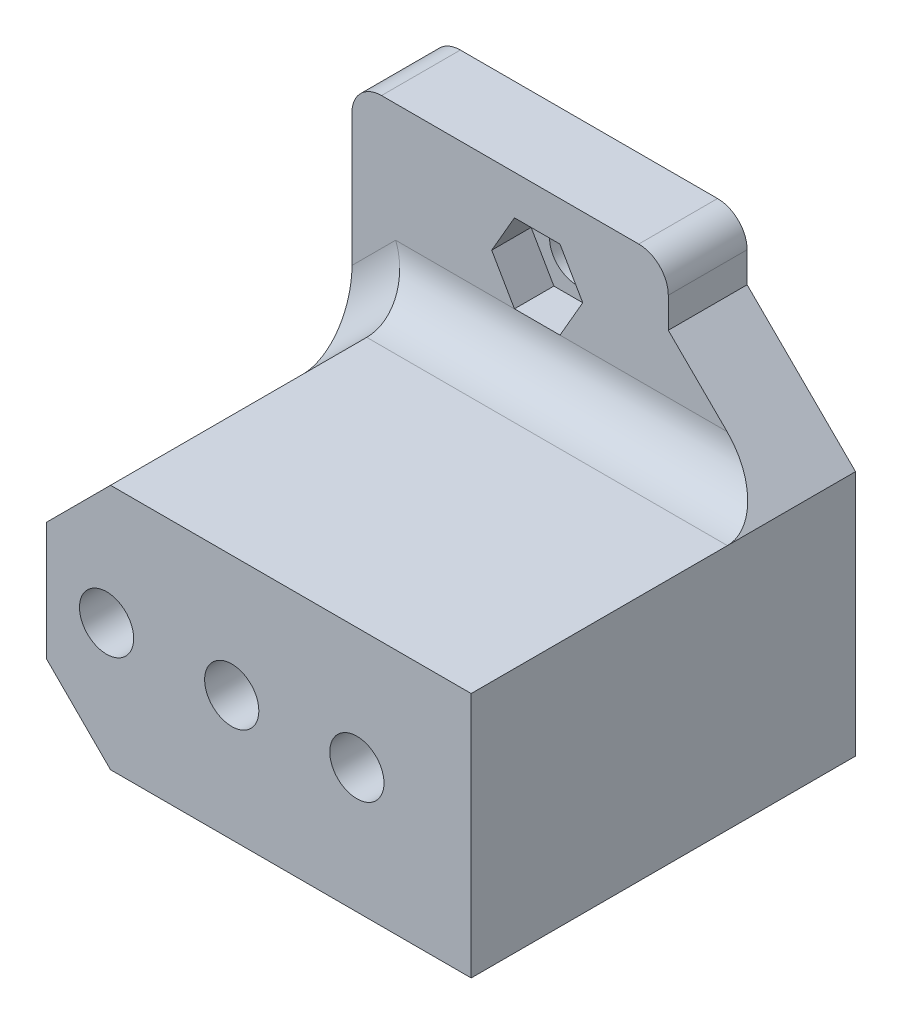
ISO-10303-21;
HEADER;
FILE_DESCRIPTION(('STEP AP214'),'2;1');
FILE_NAME('part.step','',(''),(''),'','','');
FILE_SCHEMA(('AUTOMOTIVE_DESIGN { 1 0 10303 214 1 1 1 1 }'));
ENDSEC;
DATA;
#1=APPLICATION_CONTEXT('core data for automotive mechanical design processes');
#2=APPLICATION_PROTOCOL_DEFINITION('international standard','automotive_design',2000,#1);
#3=PRODUCT_CONTEXT('',#1,'mechanical');
#4=PRODUCT('Part','Part','',(#3));
#5=PRODUCT_RELATED_PRODUCT_CATEGORY('part','',(#4));
#6=PRODUCT_DEFINITION_FORMATION('','',#4);
#7=PRODUCT_DEFINITION_CONTEXT('part definition',#1,'design');
#8=PRODUCT_DEFINITION('design','',#6,#7);
#9=PRODUCT_DEFINITION_SHAPE('','',#8);
#10=(LENGTH_UNIT() NAMED_UNIT(*) SI_UNIT(.MILLI.,.METRE.));
#11=(NAMED_UNIT(*) PLANE_ANGLE_UNIT() SI_UNIT($,.RADIAN.));
#12=(NAMED_UNIT(*) SI_UNIT($,.STERADIAN.) SOLID_ANGLE_UNIT());
#13=UNCERTAINTY_MEASURE_WITH_UNIT(LENGTH_MEASURE(1.E-05),#10,'distance_accuracy_value','');
#14=(GEOMETRIC_REPRESENTATION_CONTEXT(3) GLOBAL_UNCERTAINTY_ASSIGNED_CONTEXT((#13)) GLOBAL_UNIT_ASSIGNED_CONTEXT((#10,
#11,#12)) REPRESENTATION_CONTEXT('',''));
#15=CARTESIAN_POINT('',(0.,0.,0.));
#16=DIRECTION('',(0.,0.,1.));
#17=DIRECTION('',(1.,0.,0.));
#18=AXIS2_PLACEMENT_3D('',#15,#16,#17);
#19=CARTESIAN_POINT('',(-24.3,34.,8.));
#20=DIRECTION('',(0.,0.,-1.));
#21=DIRECTION('',(-1.,0.,0.));
#22=AXIS2_PLACEMENT_3D('',#19,#20,#21);
#23=CYLINDRICAL_SURFACE('',#22,2.75);
#24=CARTESIAN_POINT('',(-24.3,34.,0.));
#25=DIRECTION('',(0.,0.,1.));
#26=DIRECTION('',(1.,0.,0.));
#27=AXIS2_PLACEMENT_3D('',#24,#25,#26);
#28=CIRCLE('',#27,2.75);
#29=CARTESIAN_POINT('',(-21.55,34.,0.));
#30=VERTEX_POINT('',#29);
#31=EDGE_CURVE('E257',#30,#30,#28,.T.);
#32=ORIENTED_EDGE('',*,*,#31,.F.);
#33=EDGE_LOOP('',(#32));
#34=FACE_BOUND('',#33,.T.);
#35=CARTESIAN_POINT('',(-24.3,34.,4.));
#36=DIRECTION('',(0.,0.,1.));
#37=DIRECTION('',(1.,0.,0.));
#38=AXIS2_PLACEMENT_3D('',#35,#36,#37);
#39=CIRCLE('',#38,2.75);
#40=CARTESIAN_POINT('',(-21.55,34.,4.));
#41=VERTEX_POINT('',#40);
#42=EDGE_CURVE('E225',#41,#41,#39,.T.);
#43=ORIENTED_EDGE('',*,*,#42,.T.);
#44=EDGE_LOOP('',(#43));
#45=FACE_BOUND('',#44,.T.);
#46=ADVANCED_FACE('F41',(#34,#45),#23,.F.);
#47=CARTESIAN_POINT('',(0.,0.,8.));
#48=DIRECTION('',(0.,0.,-1.));
#49=DIRECTION('',(-1.,0.,0.));
#50=AXIS2_PLACEMENT_3D('',#47,#48,#49);
#51=PLANE('',#50);
#52=DIRECTION('',(0.,1.,0.));
#53=VECTOR('',#52,1.);
#54=CARTESIAN_POINT('',(-11.,42.,8.));
#55=LINE('',#54,#53);
#56=CARTESIAN_POINT('',(-11.,35.9201648339208,8.));
#57=VERTEX_POINT('',#56);
#58=CARTESIAN_POINT('',(-11.,39.,8.));
#59=VERTEX_POINT('',#58);
#60=EDGE_CURVE('E272',#57,#59,#55,.T.);
#61=ORIENTED_EDGE('',*,*,#60,.T.);
#62=CARTESIAN_POINT('',(-14.,39.,8.));
#63=DIRECTION('',(0.,0.,-1.));
#64=DIRECTION('',(-1.,0.,0.));
#65=AXIS2_PLACEMENT_3D('',#62,#63,#64);
#66=CIRCLE('',#65,3.);
#67=CARTESIAN_POINT('',(-14.,42.,8.));
#68=VERTEX_POINT('',#67);
#69=EDGE_CURVE('E49',#59,#68,#66,.F.);
#70=ORIENTED_EDGE('',*,*,#69,.T.);
#71=DIRECTION('',(-1.,0.,0.));
#72=VECTOR('',#71,1.);
#73=CARTESIAN_POINT('',(-43.1,42.,8.));
#74=LINE('',#73,#72);
#75=CARTESIAN_POINT('',(-40.1,42.,8.));
#76=VERTEX_POINT('',#75);
#77=EDGE_CURVE('E275',#68,#76,#74,.T.);
#78=ORIENTED_EDGE('',*,*,#77,.T.);
#79=CARTESIAN_POINT('',(-40.1,39.,8.));
#80=DIRECTION('',(0.,0.,-1.));
#81=DIRECTION('',(-1.,0.,0.));
#82=AXIS2_PLACEMENT_3D('',#79,#80,#81);
#83=CIRCLE('',#82,3.);
#84=CARTESIAN_POINT('',(-43.1,39.,8.));
#85=VERTEX_POINT('',#84);
#86=EDGE_CURVE('E56',#76,#85,#83,.F.);
#87=ORIENTED_EDGE('',*,*,#86,.T.);
#88=DIRECTION('',(0.,-1.,0.));
#89=VECTOR('',#88,1.);
#90=CARTESIAN_POINT('',(-43.1,0.,8.));
#91=LINE('',#90,#89);
#92=CARTESIAN_POINT('',(-43.1,25.5710678118655,8.));
#93=VERTEX_POINT('',#92);
#94=EDGE_CURVE('E277',#85,#93,#91,.T.);
#95=ORIENTED_EDGE('',*,*,#94,.T.);
#96=DIRECTION('',(-0.707106781186548,-0.707106781186547,0.));
#97=VECTOR('',#96,1.);
#98=CARTESIAN_POINT('',(-34.3355339059327,34.3355339059328,8.));
#99=LINE('',#98,#97);
#100=CARTESIAN_POINT('',(-38.6710678118655,30.,8.));
#101=VERTEX_POINT('',#100);
#102=EDGE_CURVE('E321',#93,#101,#99,.F.);
#103=ORIENTED_EDGE('',*,*,#102,.T.);
#104=DIRECTION('',(-1.,0.,0.));
#105=VECTOR('',#104,1.);
#106=CARTESIAN_POINT('',(0.,30.,8.));
#107=LINE('',#106,#105);
#108=CARTESIAN_POINT('',(-26.6094010767585,30.,8.));
#109=VERTEX_POINT('',#108);
#110=EDGE_CURVE('E318',#101,#109,#107,.F.);
#111=ORIENTED_EDGE('',*,*,#110,.T.);
#112=DIRECTION('',(0.5,-0.866025403784438,0.));
#113=VECTOR('',#112,1.);
#114=CARTESIAN_POINT('',(-28.918802153517,34.,8.));
#115=LINE('',#114,#113);
#116=CARTESIAN_POINT('',(-28.918802153517,34.,8.));
#117=VERTEX_POINT('',#116);
#118=EDGE_CURVE('E203',#117,#109,#115,.T.);
#119=ORIENTED_EDGE('',*,*,#118,.F.);
#120=DIRECTION('',(-0.5,-0.866025403784439,0.));
#121=VECTOR('',#120,1.);
#122=CARTESIAN_POINT('',(-26.6094010767585,38.,8.));
#123=LINE('',#122,#121);
#124=CARTESIAN_POINT('',(-26.6094010767585,38.,8.));
#125=VERTEX_POINT('',#124);
#126=EDGE_CURVE('E219',#125,#117,#123,.T.);
#127=ORIENTED_EDGE('',*,*,#126,.F.);
#128=DIRECTION('',(-1.,0.,0.));
#129=VECTOR('',#128,1.);
#130=CARTESIAN_POINT('',(-21.9905989232415,38.,8.));
#131=LINE('',#130,#129);
#132=CARTESIAN_POINT('',(-21.9905989232415,38.,8.));
#133=VERTEX_POINT('',#132);
#134=EDGE_CURVE('E216',#133,#125,#131,.T.);
#135=ORIENTED_EDGE('',*,*,#134,.F.);
#136=DIRECTION('',(-0.5,0.866025403784439,0.));
#137=VECTOR('',#136,1.);
#138=CARTESIAN_POINT('',(-19.681197846483,34.,8.));
#139=LINE('',#138,#137);
#140=CARTESIAN_POINT('',(-19.681197846483,34.,8.));
#141=VERTEX_POINT('',#140);
#142=EDGE_CURVE('E214',#141,#133,#139,.T.);
#143=ORIENTED_EDGE('',*,*,#142,.F.);
#144=DIRECTION('',(0.499999999999999,0.866025403784439,0.));
#145=VECTOR('',#144,1.);
#146=CARTESIAN_POINT('',(-21.9905989232415,30.,8.));
#147=LINE('',#146,#145);
#148=CARTESIAN_POINT('',(-21.9905989232415,30.,8.));
#149=VERTEX_POINT('',#148);
#150=EDGE_CURVE('E182',#149,#141,#147,.T.);
#151=ORIENTED_EDGE('',*,*,#150,.F.);
#152=CARTESIAN_POINT('',(-5.03655401145193,30.,8.));
#153=VERTEX_POINT('',#152);
#154=EDGE_CURVE('E317',#149,#153,#107,.F.);
#155=ORIENTED_EDGE('',*,*,#154,.T.);
#156=DIRECTION('',(-0.709677419354839,0.70452676347876,0.));
#157=VECTOR('',#156,1.);
#158=CARTESIAN_POINT('',(-11.,35.9201648339208,8.));
#159=LINE('',#158,#157);
#160=EDGE_CURVE('E270',#153,#57,#159,.T.);
#161=ORIENTED_EDGE('',*,*,#160,.T.);
#162=EDGE_LOOP('',(#61,#70,#78,#87,#95,#103,#111,#119,#127,#135,#143,#151,#155,#161));
#163=FACE_BOUND('',#162,.T.);
#164=ADVANCED_FACE('F349',(#163),#51,.F.);
#165=CARTESIAN_POINT('',(0.,0.,0.));
#166=DIRECTION('',(0.,0.,-1.));
#167=DIRECTION('',(-1.,0.,0.));
#168=AXIS2_PLACEMENT_3D('',#165,#166,#167);
#169=PLANE('',#168);
#170=CARTESIAN_POINT('',(-37.,12.7,0.));
#171=DIRECTION('',(0.,0.,1.));
#172=DIRECTION('',(1.,0.,0.));
#173=AXIS2_PLACEMENT_3D('',#170,#171,#172);
#174=CIRCLE('',#173,2.75);
#175=CARTESIAN_POINT('',(-34.25,12.7,0.));
#176=VERTEX_POINT('',#175);
#177=EDGE_CURVE('E260',#176,#176,#174,.T.);
#178=ORIENTED_EDGE('',*,*,#177,.T.);
#179=EDGE_LOOP('',(#178));
#180=FACE_BOUND('',#179,.T.);
#181=CARTESIAN_POINT('',(-11.6,12.7,0.));
#182=DIRECTION('',(0.,0.,1.));
#183=DIRECTION('',(1.,0.,0.));
#184=AXIS2_PLACEMENT_3D('',#181,#182,#183);
#185=CIRCLE('',#184,2.75);
#186=CARTESIAN_POINT('',(-8.85,12.7,0.));
#187=VERTEX_POINT('',#186);
#188=EDGE_CURVE('E266',#187,#187,#185,.T.);
#189=ORIENTED_EDGE('',*,*,#188,.T.);
#190=EDGE_LOOP('',(#189));
#191=FACE_BOUND('',#190,.T.);
#192=DIRECTION('',(-1.,0.,0.));
#193=VECTOR('',#192,1.);
#194=CARTESIAN_POINT('',(-43.1,42.,0.));
#195=LINE('',#194,#193);
#196=CARTESIAN_POINT('',(-14.,42.,0.));
#197=VERTEX_POINT('',#196);
#198=CARTESIAN_POINT('',(-40.1,42.,0.));
#199=VERTEX_POINT('',#198);
#200=EDGE_CURVE('E286',#197,#199,#195,.T.);
#201=ORIENTED_EDGE('',*,*,#200,.F.);
#202=CARTESIAN_POINT('',(-14.,39.,0.));
#203=DIRECTION('',(0.,0.,-1.));
#204=DIRECTION('',(-1.,0.,0.));
#205=AXIS2_PLACEMENT_3D('',#202,#203,#204);
#206=CIRCLE('',#205,3.);
#207=CARTESIAN_POINT('',(-11.,39.,0.));
#208=VERTEX_POINT('',#207);
#209=EDGE_CURVE('E344',#197,#208,#206,.T.);
#210=ORIENTED_EDGE('',*,*,#209,.T.);
#211=DIRECTION('',(0.,1.,0.));
#212=VECTOR('',#211,1.);
#213=CARTESIAN_POINT('',(-11.,42.,0.));
#214=LINE('',#213,#212);
#215=CARTESIAN_POINT('',(-11.,35.9201648339208,0.));
#216=VERTEX_POINT('',#215);
#217=EDGE_CURVE('E284',#216,#208,#214,.T.);
#218=ORIENTED_EDGE('',*,*,#217,.F.);
#219=DIRECTION('',(-0.709677419354839,0.70452676347876,0.));
#220=VECTOR('',#219,1.);
#221=CARTESIAN_POINT('',(-11.,35.9201648339208,0.));
#222=LINE('',#221,#220);
#223=CARTESIAN_POINT('',(0.,25.,0.));
#224=VERTEX_POINT('',#223);
#225=EDGE_CURVE('E282',#224,#216,#222,.T.);
#226=ORIENTED_EDGE('',*,*,#225,.F.);
#227=DIRECTION('',(0.,1.,0.));
#228=VECTOR('',#227,1.);
#229=CARTESIAN_POINT('',(0.,25.,0.));
#230=LINE('',#229,#228);
#231=CARTESIAN_POINT('',(0.,0.,0.));
#232=VERTEX_POINT('',#231);
#233=EDGE_CURVE('E269',#232,#224,#230,.T.);
#234=ORIENTED_EDGE('',*,*,#233,.F.);
#235=DIRECTION('',(1.,0.,0.));
#236=VECTOR('',#235,1.);
#237=CARTESIAN_POINT('',(0.,0.,0.));
#238=LINE('',#237,#236);
#239=CARTESIAN_POINT('',(-36.6,0.,0.));
#240=VERTEX_POINT('',#239);
#241=EDGE_CURVE('E273',#240,#232,#238,.T.);
#242=ORIENTED_EDGE('',*,*,#241,.F.);
#243=DIRECTION('',(0.707106781186547,-0.707106781186548,0.));
#244=VECTOR('',#243,1.);
#245=CARTESIAN_POINT('',(-18.3,-18.3,0.));
#246=LINE('',#245,#244);
#247=CARTESIAN_POINT('',(-43.1,6.50000000000001,0.));
#248=VERTEX_POINT('',#247);
#249=EDGE_CURVE('E314',#240,#248,#246,.F.);
#250=ORIENTED_EDGE('',*,*,#249,.T.);
#251=DIRECTION('',(0.,-1.,0.));
#252=VECTOR('',#251,1.);
#253=CARTESIAN_POINT('',(-43.1,0.,0.));
#254=LINE('',#253,#252);
#255=CARTESIAN_POINT('',(-43.1,39.,0.));
#256=VERTEX_POINT('',#255);
#257=EDGE_CURVE('E289',#256,#248,#254,.T.);
#258=ORIENTED_EDGE('',*,*,#257,.F.);
#259=CARTESIAN_POINT('',(-40.1,39.,0.));
#260=DIRECTION('',(0.,0.,-1.));
#261=DIRECTION('',(-1.,0.,0.));
#262=AXIS2_PLACEMENT_3D('',#259,#260,#261);
#263=CIRCLE('',#262,3.);
#264=EDGE_CURVE('E342',#256,#199,#263,.T.);
#265=ORIENTED_EDGE('',*,*,#264,.T.);
#266=EDGE_LOOP('',(#201,#210,#218,#226,#234,#242,#250,#258,#265));
#267=FACE_BOUND('',#266,.T.);
#268=CARTESIAN_POINT('',(-24.3,12.7,0.));
#269=DIRECTION('',(0.,0.,1.));
#270=DIRECTION('',(1.,0.,0.));
#271=AXIS2_PLACEMENT_3D('',#268,#269,#270);
#272=CIRCLE('',#271,2.75);
#273=CARTESIAN_POINT('',(-21.55,12.7,0.));
#274=VERTEX_POINT('',#273);
#275=EDGE_CURVE('E263',#274,#274,#272,.T.);
#276=ORIENTED_EDGE('',*,*,#275,.T.);
#277=EDGE_LOOP('',(#276));
#278=FACE_BOUND('',#277,.T.);
#279=ORIENTED_EDGE('',*,*,#31,.T.);
#280=EDGE_LOOP('',(#279));
#281=FACE_BOUND('',#280,.T.);
#282=ADVANCED_FACE('F359',(#180,#191,#267,#278,#281),#169,.T.);
#283=CARTESIAN_POINT('',(0.,25.,8.));
#284=DIRECTION('',(-1.,0.,0.));
#285=DIRECTION('',(0.,0.,1.));
#286=AXIS2_PLACEMENT_3D('',#283,#284,#285);
#287=PLANE('',#286);
#288=ORIENTED_EDGE('',*,*,#233,.T.);
#289=DIRECTION('',(0.,0.,-1.));
#290=VECTOR('',#289,1.);
#291=CARTESIAN_POINT('',(0.,25.,8.));
#292=LINE('',#291,#290);
#293=CARTESIAN_POINT('',(0.,25.,13.));
#294=VERTEX_POINT('',#293);
#295=EDGE_CURVE('E297',#294,#224,#292,.T.);
#296=ORIENTED_EDGE('',*,*,#295,.F.);
#297=DIRECTION('',(0.,0.,-1.));
#298=VECTOR('',#297,1.);
#299=CARTESIAN_POINT('',(0.,25.,39.));
#300=LINE('',#299,#298);
#301=CARTESIAN_POINT('',(0.,25.,39.));
#302=VERTEX_POINT('',#301);
#303=EDGE_CURVE('E254',#302,#294,#300,.T.);
#304=ORIENTED_EDGE('',*,*,#303,.F.);
#305=DIRECTION('',(0.,1.,0.));
#306=VECTOR('',#305,1.);
#307=CARTESIAN_POINT('',(0.,0.,39.));
#308=LINE('',#307,#306);
#309=CARTESIAN_POINT('',(0.,0.,39.));
#310=VERTEX_POINT('',#309);
#311=EDGE_CURVE('E246',#310,#302,#308,.T.);
#312=ORIENTED_EDGE('',*,*,#311,.F.);
#313=DIRECTION('',(0.,0.,-1.));
#314=VECTOR('',#313,1.);
#315=CARTESIAN_POINT('',(0.,0.,8.));
#316=LINE('',#315,#314);
#317=EDGE_CURVE('E279',#310,#232,#316,.T.);
#318=ORIENTED_EDGE('',*,*,#317,.T.);
#319=EDGE_LOOP('',(#288,#296,#304,#312,#318));
#320=FACE_BOUND('',#319,.T.);
#321=ADVANCED_FACE('F370',(#320),#287,.F.);
#322=CARTESIAN_POINT('',(-11.,35.9201648339208,8.));
#323=DIRECTION('',(-0.70452676347876,-0.709677419354839,0.));
#324=DIRECTION('',(0.709677419354839,-0.70452676347876,0.));
#325=AXIS2_PLACEMENT_3D('',#322,#323,#324);
#326=PLANE('',#325);
#327=ORIENTED_EDGE('',*,*,#225,.T.);
#328=DIRECTION('',(0.,0.,-1.));
#329=VECTOR('',#328,1.);
#330=CARTESIAN_POINT('',(-11.,35.9201648339208,8.));
#331=LINE('',#330,#329);
#332=EDGE_CURVE('E294',#57,#216,#331,.T.);
#333=ORIENTED_EDGE('',*,*,#332,.F.);
#334=ORIENTED_EDGE('',*,*,#160,.F.);
#335=CARTESIAN_POINT('',(-5.03655401145194,30.,13.));
#336=DIRECTION('',(-0.70452676347876,-0.709677419354839,0.));
#337=DIRECTION('',(0.709677419354839,-0.70452676347876,0.));
#338=AXIS2_PLACEMENT_3D('',#335,#336,#337);
#339=ELLIPSE('',#338,7.09696247068227,5.);
#340=EDGE_CURVE('E331',#153,#294,#339,.T.);
#341=ORIENTED_EDGE('',*,*,#340,.T.);
#342=ORIENTED_EDGE('',*,*,#295,.T.);
#343=EDGE_LOOP('',(#327,#333,#334,#341,#342));
#344=FACE_BOUND('',#343,.T.);
#345=ADVANCED_FACE('F365',(#344),#326,.F.);
#346=CARTESIAN_POINT('',(-11.,42.,8.));
#347=DIRECTION('',(-1.,0.,0.));
#348=DIRECTION('',(0.,-1.,0.));
#349=AXIS2_PLACEMENT_3D('',#346,#347,#348);
#350=PLANE('',#349);
#351=ORIENTED_EDGE('',*,*,#217,.T.);
#352=DIRECTION('',(0.,0.,-1.));
#353=VECTOR('',#352,1.);
#354=CARTESIAN_POINT('',(-11.,39.,8.));
#355=LINE('',#354,#353);
#356=EDGE_CURVE('E64',#208,#59,#355,.F.);
#357=ORIENTED_EDGE('',*,*,#356,.T.);
#358=ORIENTED_EDGE('',*,*,#60,.F.);
#359=ORIENTED_EDGE('',*,*,#332,.T.);
#360=EDGE_LOOP('',(#351,#357,#358,#359));
#361=FACE_BOUND('',#360,.T.);
#362=ADVANCED_FACE('F361',(#361),#350,.F.);
#363=CARTESIAN_POINT('',(-43.1,42.,8.));
#364=DIRECTION('',(0.,-1.,0.));
#365=DIRECTION('',(0.,0.,-1.));
#366=AXIS2_PLACEMENT_3D('',#363,#364,#365);
#367=PLANE('',#366);
#368=ORIENTED_EDGE('',*,*,#77,.F.);
#369=DIRECTION('',(0.,0.,-1.));
#370=VECTOR('',#369,1.);
#371=CARTESIAN_POINT('',(-14.,42.,8.));
#372=LINE('',#371,#370);
#373=EDGE_CURVE('E339',#68,#197,#372,.T.);
#374=ORIENTED_EDGE('',*,*,#373,.T.);
#375=ORIENTED_EDGE('',*,*,#200,.T.);
#376=DIRECTION('',(0.,0.,-1.));
#377=VECTOR('',#376,1.);
#378=CARTESIAN_POINT('',(-40.1,42.,8.));
#379=LINE('',#378,#377);
#380=EDGE_CURVE('E334',#199,#76,#379,.F.);
#381=ORIENTED_EDGE('',*,*,#380,.T.);
#382=EDGE_LOOP('',(#368,#374,#375,#381));
#383=FACE_BOUND('',#382,.T.);
#384=ADVANCED_FACE('F353',(#383),#367,.F.);
#385=CARTESIAN_POINT('',(-43.1,0.,8.));
#386=DIRECTION('',(1.,0.,0.));
#387=DIRECTION('',(0.,0.,-1.));
#388=AXIS2_PLACEMENT_3D('',#385,#386,#387);
#389=PLANE('',#388);
#390=ORIENTED_EDGE('',*,*,#94,.F.);
#391=DIRECTION('',(0.,0.,-1.));
#392=VECTOR('',#391,1.);
#393=CARTESIAN_POINT('',(-43.1,39.,8.));
#394=LINE('',#393,#392);
#395=EDGE_CURVE('E11',#85,#256,#394,.T.);
#396=ORIENTED_EDGE('',*,*,#395,.T.);
#397=ORIENTED_EDGE('',*,*,#257,.T.);
#398=DIRECTION('',(0.,0.,1.));
#399=VECTOR('',#398,1.);
#400=CARTESIAN_POINT('',(-43.1,6.50000000000001,8.));
#401=LINE('',#400,#399);
#402=CARTESIAN_POINT('',(-43.1,6.50000000000001,39.));
#403=VERTEX_POINT('',#402);
#404=EDGE_CURVE('E300',#248,#403,#401,.T.);
#405=ORIENTED_EDGE('',*,*,#404,.T.);
#406=DIRECTION('',(0.,-1.,0.));
#407=VECTOR('',#406,1.);
#408=CARTESIAN_POINT('',(-43.1,25.,39.));
#409=LINE('',#408,#407);
#410=CARTESIAN_POINT('',(-43.1,18.5,39.));
#411=VERTEX_POINT('',#410);
#412=EDGE_CURVE('E251',#411,#403,#409,.T.);
#413=ORIENTED_EDGE('',*,*,#412,.F.);
#414=DIRECTION('',(0.,0.,-1.));
#415=VECTOR('',#414,1.);
#416=CARTESIAN_POINT('',(-43.1,18.5,8.));
#417=LINE('',#416,#415);
#418=CARTESIAN_POINT('',(-43.1,18.5,13.));
#419=VERTEX_POINT('',#418);
#420=EDGE_CURVE('E302',#411,#419,#417,.T.);
#421=ORIENTED_EDGE('',*,*,#420,.T.);
#422=CARTESIAN_POINT('',(-43.1,25.5710678118655,13.));
#423=DIRECTION('',(1.,0.,0.));
#424=DIRECTION('',(0.,-1.,0.));
#425=AXIS2_PLACEMENT_3D('',#422,#423,#424);
#426=ELLIPSE('',#425,7.07106781186547,5.);
#427=EDGE_CURVE('E328',#419,#93,#426,.T.);
#428=ORIENTED_EDGE('',*,*,#427,.T.);
#429=EDGE_LOOP('',(#390,#396,#397,#405,#413,#421,#428));
#430=FACE_BOUND('',#429,.T.);
#431=ADVANCED_FACE('F384',(#430),#389,.F.);
#432=CARTESIAN_POINT('',(0.,0.,8.));
#433=DIRECTION('',(0.,1.,0.));
#434=DIRECTION('',(-1.,0.,0.));
#435=AXIS2_PLACEMENT_3D('',#432,#433,#434);
#436=PLANE('',#435);
#437=DIRECTION('',(1.,0.,0.));
#438=VECTOR('',#437,1.);
#439=CARTESIAN_POINT('',(-43.1,0.,39.));
#440=LINE('',#439,#438);
#441=CARTESIAN_POINT('',(-36.6,0.,39.));
#442=VERTEX_POINT('',#441);
#443=EDGE_CURVE('E244',#442,#310,#440,.T.);
#444=ORIENTED_EDGE('',*,*,#443,.F.);
#445=DIRECTION('',(0.,0.,-1.));
#446=VECTOR('',#445,1.);
#447=CARTESIAN_POINT('',(-36.6,0.,8.));
#448=LINE('',#447,#446);
#449=EDGE_CURVE('E311',#442,#240,#448,.T.);
#450=ORIENTED_EDGE('',*,*,#449,.T.);
#451=ORIENTED_EDGE('',*,*,#241,.T.);
#452=ORIENTED_EDGE('',*,*,#317,.F.);
#453=EDGE_LOOP('',(#444,#450,#451,#452));
#454=FACE_BOUND('',#453,.T.);
#455=ADVANCED_FACE('F376',(#454),#436,.F.);
#456=CARTESIAN_POINT('',(-11.6,12.7,8.));
#457=DIRECTION('',(0.,0.,-1.));
#458=DIRECTION('',(-1.,0.,0.));
#459=AXIS2_PLACEMENT_3D('',#456,#457,#458);
#460=CYLINDRICAL_SURFACE('',#459,2.75);
#461=ORIENTED_EDGE('',*,*,#188,.F.);
#462=EDGE_LOOP('',(#461));
#463=FACE_BOUND('',#462,.T.);
#464=CARTESIAN_POINT('',(-11.6,12.7,39.));
#465=DIRECTION('',(0.,0.,1.));
#466=DIRECTION('',(1.,0.,0.));
#467=AXIS2_PLACEMENT_3D('',#464,#465,#466);
#468=CIRCLE('',#467,2.75);
#469=CARTESIAN_POINT('',(-8.85,12.7,39.));
#470=VERTEX_POINT('',#469);
#471=EDGE_CURVE('E241',#470,#470,#468,.T.);
#472=ORIENTED_EDGE('',*,*,#471,.T.);
#473=EDGE_LOOP('',(#472));
#474=FACE_BOUND('',#473,.T.);
#475=ADVANCED_FACE('F413',(#463,#474),#460,.F.);
#476=CARTESIAN_POINT('',(-24.3,12.7,8.));
#477=DIRECTION('',(0.,0.,-1.));
#478=DIRECTION('',(-1.,0.,0.));
#479=AXIS2_PLACEMENT_3D('',#476,#477,#478);
#480=CYLINDRICAL_SURFACE('',#479,2.75);
#481=ORIENTED_EDGE('',*,*,#275,.F.);
#482=EDGE_LOOP('',(#481));
#483=FACE_BOUND('',#482,.T.);
#484=CARTESIAN_POINT('',(-24.3,12.7,39.));
#485=DIRECTION('',(0.,0.,1.));
#486=DIRECTION('',(1.,0.,0.));
#487=AXIS2_PLACEMENT_3D('',#484,#485,#486);
#488=CIRCLE('',#487,2.75);
#489=CARTESIAN_POINT('',(-21.55,12.7,39.));
#490=VERTEX_POINT('',#489);
#491=EDGE_CURVE('E237',#490,#490,#488,.T.);
#492=ORIENTED_EDGE('',*,*,#491,.T.);
#493=EDGE_LOOP('',(#492));
#494=FACE_BOUND('',#493,.T.);
#495=ADVANCED_FACE('F409',(#483,#494),#480,.F.);
#496=CARTESIAN_POINT('',(-37.,12.7,8.));
#497=DIRECTION('',(0.,0.,-1.));
#498=DIRECTION('',(-1.,0.,0.));
#499=AXIS2_PLACEMENT_3D('',#496,#497,#498);
#500=CYLINDRICAL_SURFACE('',#499,2.75);
#501=ORIENTED_EDGE('',*,*,#177,.F.);
#502=EDGE_LOOP('',(#501));
#503=FACE_BOUND('',#502,.T.);
#504=CARTESIAN_POINT('',(-37.,12.7,39.));
#505=DIRECTION('',(0.,0.,1.));
#506=DIRECTION('',(1.,0.,0.));
#507=AXIS2_PLACEMENT_3D('',#504,#505,#506);
#508=CIRCLE('',#507,2.75);
#509=CARTESIAN_POINT('',(-34.25,12.7,39.));
#510=VERTEX_POINT('',#509);
#511=EDGE_CURVE('E234',#510,#510,#508,.T.);
#512=ORIENTED_EDGE('',*,*,#511,.T.);
#513=EDGE_LOOP('',(#512));
#514=FACE_BOUND('',#513,.T.);
#515=ADVANCED_FACE('F405',(#503,#514),#500,.F.);
#516=CARTESIAN_POINT('',(0.,0.,39.));
#517=DIRECTION('',(0.,0.,1.));
#518=DIRECTION('',(1.,0.,0.));
#519=AXIS2_PLACEMENT_3D('',#516,#517,#518);
#520=PLANE('',#519);
#521=ORIENTED_EDGE('',*,*,#491,.F.);
#522=EDGE_LOOP('',(#521));
#523=FACE_BOUND('',#522,.T.);
#524=DIRECTION('',(-1.,0.,0.));
#525=VECTOR('',#524,1.);
#526=CARTESIAN_POINT('',(0.,25.,39.));
#527=LINE('',#526,#525);
#528=CARTESIAN_POINT('',(-36.6,25.,39.));
#529=VERTEX_POINT('',#528);
#530=EDGE_CURVE('E248',#302,#529,#527,.T.);
#531=ORIENTED_EDGE('',*,*,#530,.T.);
#532=DIRECTION('',(0.707106781186548,0.707106781186547,0.));
#533=VECTOR('',#532,1.);
#534=CARTESIAN_POINT('',(-30.8,30.8,39.));
#535=LINE('',#534,#533);
#536=EDGE_CURVE('E309',#529,#411,#535,.F.);
#537=ORIENTED_EDGE('',*,*,#536,.T.);
#538=ORIENTED_EDGE('',*,*,#412,.T.);
#539=DIRECTION('',(-0.707106781186547,0.707106781186548,0.));
#540=VECTOR('',#539,1.);
#541=CARTESIAN_POINT('',(-18.3,-18.3,39.));
#542=LINE('',#541,#540);
#543=EDGE_CURVE('E307',#403,#442,#542,.F.);
#544=ORIENTED_EDGE('',*,*,#543,.T.);
#545=ORIENTED_EDGE('',*,*,#443,.T.);
#546=ORIENTED_EDGE('',*,*,#311,.T.);
#547=EDGE_LOOP('',(#531,#537,#538,#544,#545,#546));
#548=FACE_BOUND('',#547,.T.);
#549=ORIENTED_EDGE('',*,*,#471,.F.);
#550=EDGE_LOOP('',(#549));
#551=FACE_BOUND('',#550,.T.);
#552=ORIENTED_EDGE('',*,*,#511,.F.);
#553=EDGE_LOOP('',(#552));
#554=FACE_BOUND('',#553,.T.);
#555=ADVANCED_FACE('F408',(#523,#548,#551,#554),#520,.T.);
#556=CARTESIAN_POINT('',(0.,25.,39.));
#557=DIRECTION('',(0.,-1.,0.));
#558=DIRECTION('',(1.,0.,0.));
#559=AXIS2_PLACEMENT_3D('',#556,#557,#558);
#560=PLANE('',#559);
#561=ORIENTED_EDGE('',*,*,#303,.T.);
#562=DIRECTION('',(-1.,0.,0.));
#563=VECTOR('',#562,1.);
#564=CARTESIAN_POINT('',(-36.6,25.,13.));
#565=LINE('',#564,#563);
#566=CARTESIAN_POINT('',(-36.6,25.,13.));
#567=VERTEX_POINT('',#566);
#568=EDGE_CURVE('E326',#294,#567,#565,.T.);
#569=ORIENTED_EDGE('',*,*,#568,.T.);
#570=DIRECTION('',(0.,0.,1.));
#571=VECTOR('',#570,1.);
#572=CARTESIAN_POINT('',(-36.6,25.,39.));
#573=LINE('',#572,#571);
#574=EDGE_CURVE('E305',#567,#529,#573,.T.);
#575=ORIENTED_EDGE('',*,*,#574,.T.);
#576=ORIENTED_EDGE('',*,*,#530,.F.);
#577=EDGE_LOOP('',(#561,#569,#575,#576));
#578=FACE_BOUND('',#577,.T.);
#579=ADVANCED_FACE('F403',(#578),#560,.F.);
#580=CARTESIAN_POINT('',(-43.1,18.5,8.));
#581=DIRECTION('',(0.707106781186547,-0.707106781186548,0.));
#582=DIRECTION('',(0.,0.,-1.));
#583=AXIS2_PLACEMENT_3D('',#580,#581,#582);
#584=PLANE('',#583);
#585=ORIENTED_EDGE('',*,*,#574,.F.);
#586=DIRECTION('',(0.707106781186548,0.707106781186547,0.));
#587=VECTOR('',#586,1.);
#588=CARTESIAN_POINT('',(-43.1,18.5,13.));
#589=LINE('',#588,#587);
#590=EDGE_CURVE('E324',#567,#419,#589,.F.);
#591=ORIENTED_EDGE('',*,*,#590,.T.);
#592=ORIENTED_EDGE('',*,*,#420,.F.);
#593=ORIENTED_EDGE('',*,*,#536,.F.);
#594=EDGE_LOOP('',(#585,#591,#592,#593));
#595=FACE_BOUND('',#594,.T.);
#596=ADVANCED_FACE('F434',(#595),#584,.F.);
#597=CARTESIAN_POINT('',(-36.6,0.,8.));
#598=DIRECTION('',(0.707106781186548,0.707106781186547,0.));
#599=DIRECTION('',(0.,0.,-1.));
#600=AXIS2_PLACEMENT_3D('',#597,#598,#599);
#601=PLANE('',#600);
#602=ORIENTED_EDGE('',*,*,#543,.F.);
#603=ORIENTED_EDGE('',*,*,#404,.F.);
#604=ORIENTED_EDGE('',*,*,#249,.F.);
#605=ORIENTED_EDGE('',*,*,#449,.F.);
#606=EDGE_LOOP('',(#602,#603,#604,#605));
#607=FACE_BOUND('',#606,.T.);
#608=ADVANCED_FACE('F380',(#607),#601,.F.);
#609=CARTESIAN_POINT('',(0.,30.,13.));
#610=DIRECTION('',(1.,0.,0.));
#611=DIRECTION('',(0.,1.,0.));
#612=AXIS2_PLACEMENT_3D('',#609,#610,#611);
#613=CYLINDRICAL_SURFACE('',#612,5.);
#614=ORIENTED_EDGE('',*,*,#340,.F.);
#615=ORIENTED_EDGE('',*,*,#154,.F.);
#616=DIRECTION('',(1.,0.,0.));
#617=VECTOR('',#616,1.);
#618=CARTESIAN_POINT('',(-26.6094010767585,30.,8.));
#619=LINE('',#618,#617);
#620=EDGE_CURVE('E200',#109,#149,#619,.T.);
#621=ORIENTED_EDGE('',*,*,#620,.F.);
#622=ORIENTED_EDGE('',*,*,#110,.F.);
#623=CARTESIAN_POINT('',(-38.6710678118655,30.,13.));
#624=DIRECTION('',(0.923879532511287,0.382683432365089,0.));
#625=DIRECTION('',(0.382683432365089,-0.923879532511287,0.));
#626=AXIS2_PLACEMENT_3D('',#623,#624,#625);
#627=ELLIPSE('',#626,5.41196100146197,5.);
#628=EDGE_CURVE('E238',#567,#101,#627,.T.);
#629=ORIENTED_EDGE('',*,*,#628,.F.);
#630=ORIENTED_EDGE('',*,*,#568,.F.);
#631=EDGE_LOOP('',(#614,#615,#621,#622,#629,#630));
#632=FACE_BOUND('',#631,.T.);
#633=ADVANCED_FACE('F445',(#632),#613,.F.);
#634=CARTESIAN_POINT('',(-34.3355339059327,34.3355339059328,13.));
#635=DIRECTION('',(-0.707106781186548,-0.707106781186547,0.));
#636=DIRECTION('',(0.707106781186547,-0.707106781186548,0.));
#637=AXIS2_PLACEMENT_3D('',#634,#635,#636);
#638=CYLINDRICAL_SURFACE('',#637,5.);
#639=ORIENTED_EDGE('',*,*,#427,.F.);
#640=ORIENTED_EDGE('',*,*,#590,.F.);
#641=ORIENTED_EDGE('',*,*,#628,.T.);
#642=ORIENTED_EDGE('',*,*,#102,.F.);
#643=EDGE_LOOP('',(#639,#640,#641,#642));
#644=FACE_BOUND('',#643,.T.);
#645=ADVANCED_FACE('F446',(#644),#638,.F.);
#646=CARTESIAN_POINT('',(-21.9905989232415,30.,4.));
#647=DIRECTION('',(0.866025403784439,-0.499999999999999,0.));
#648=DIRECTION('',(0.499999999999999,0.866025403784439,0.));
#649=AXIS2_PLACEMENT_3D('',#646,#647,#648);
#650=PLANE('',#649);
#651=ORIENTED_EDGE('',*,*,#150,.T.);
#652=DIRECTION('',(0.,0.,1.));
#653=VECTOR('',#652,1.);
#654=CARTESIAN_POINT('',(-19.681197846483,34.,4.));
#655=LINE('',#654,#653);
#656=CARTESIAN_POINT('',(-19.681197846483,34.,4.));
#657=VERTEX_POINT('',#656);
#658=EDGE_CURVE('E175',#657,#141,#655,.T.);
#659=ORIENTED_EDGE('',*,*,#658,.F.);
#660=DIRECTION('',(0.499999999999999,0.866025403784439,0.));
#661=VECTOR('',#660,1.);
#662=CARTESIAN_POINT('',(-21.9905989232415,30.,4.));
#663=LINE('',#662,#661);
#664=CARTESIAN_POINT('',(-21.9905989232415,30.,4.));
#665=VERTEX_POINT('',#664);
#666=EDGE_CURVE('E179',#665,#657,#663,.T.);
#667=ORIENTED_EDGE('',*,*,#666,.F.);
#668=DIRECTION('',(0.,0.,1.));
#669=VECTOR('',#668,1.);
#670=CARTESIAN_POINT('',(-21.9905989232415,30.,4.));
#671=LINE('',#670,#669);
#672=EDGE_CURVE('E223',#665,#149,#671,.T.);
#673=ORIENTED_EDGE('',*,*,#672,.T.);
#674=EDGE_LOOP('',(#651,#659,#667,#673));
#675=FACE_BOUND('',#674,.T.);
#676=ADVANCED_FACE('F177',(#675),#650,.F.);
#677=CARTESIAN_POINT('',(-26.6094010767585,30.,4.));
#678=DIRECTION('',(0.,-1.,0.));
#679=DIRECTION('',(0.,0.,-1.));
#680=AXIS2_PLACEMENT_3D('',#677,#678,#679);
#681=PLANE('',#680);
#682=ORIENTED_EDGE('',*,*,#620,.T.);
#683=ORIENTED_EDGE('',*,*,#672,.F.);
#684=DIRECTION('',(1.,0.,0.));
#685=VECTOR('',#684,1.);
#686=CARTESIAN_POINT('',(-26.6094010767585,30.,4.));
#687=LINE('',#686,#685);
#688=CARTESIAN_POINT('',(-26.6094010767585,30.,4.));
#689=VERTEX_POINT('',#688);
#690=EDGE_CURVE('E187',#689,#665,#687,.T.);
#691=ORIENTED_EDGE('',*,*,#690,.F.);
#692=DIRECTION('',(0.,0.,1.));
#693=VECTOR('',#692,1.);
#694=CARTESIAN_POINT('',(-26.6094010767585,30.,4.));
#695=LINE('',#694,#693);
#696=EDGE_CURVE('E226',#689,#109,#695,.T.);
#697=ORIENTED_EDGE('',*,*,#696,.T.);
#698=EDGE_LOOP('',(#682,#683,#691,#697));
#699=FACE_BOUND('',#698,.T.);
#700=ADVANCED_FACE('F483',(#699),#681,.F.);
#701=CARTESIAN_POINT('',(-28.918802153517,34.,4.));
#702=DIRECTION('',(-0.866025403784438,-0.5,0.));
#703=DIRECTION('',(0.5,-0.866025403784439,0.));
#704=AXIS2_PLACEMENT_3D('',#701,#702,#703);
#705=PLANE('',#704);
#706=ORIENTED_EDGE('',*,*,#118,.T.);
#707=ORIENTED_EDGE('',*,*,#696,.F.);
#708=DIRECTION('',(0.5,-0.866025403784438,0.));
#709=VECTOR('',#708,1.);
#710=CARTESIAN_POINT('',(-28.918802153517,34.,4.));
#711=LINE('',#710,#709);
#712=CARTESIAN_POINT('',(-28.918802153517,34.,4.));
#713=VERTEX_POINT('',#712);
#714=EDGE_CURVE('E210',#713,#689,#711,.T.);
#715=ORIENTED_EDGE('',*,*,#714,.F.);
#716=DIRECTION('',(0.,0.,1.));
#717=VECTOR('',#716,1.);
#718=CARTESIAN_POINT('',(-28.918802153517,34.,4.));
#719=LINE('',#718,#717);
#720=EDGE_CURVE('E229',#713,#117,#719,.T.);
#721=ORIENTED_EDGE('',*,*,#720,.T.);
#722=EDGE_LOOP('',(#706,#707,#715,#721));
#723=FACE_BOUND('',#722,.T.);
#724=ADVANCED_FACE('F493',(#723),#705,.F.);
#725=CARTESIAN_POINT('',(-26.6094010767585,38.,4.));
#726=DIRECTION('',(-0.866025403784439,0.5,0.));
#727=DIRECTION('',(-0.5,-0.866025403784439,0.));
#728=AXIS2_PLACEMENT_3D('',#725,#726,#727);
#729=PLANE('',#728);
#730=ORIENTED_EDGE('',*,*,#126,.T.);
#731=ORIENTED_EDGE('',*,*,#720,.F.);
#732=DIRECTION('',(-0.5,-0.866025403784439,0.));
#733=VECTOR('',#732,1.);
#734=CARTESIAN_POINT('',(-26.6094010767585,38.,4.));
#735=LINE('',#734,#733);
#736=CARTESIAN_POINT('',(-26.6094010767585,38.,4.));
#737=VERTEX_POINT('',#736);
#738=EDGE_CURVE('E207',#737,#713,#735,.T.);
#739=ORIENTED_EDGE('',*,*,#738,.F.);
#740=DIRECTION('',(0.,0.,1.));
#741=VECTOR('',#740,1.);
#742=CARTESIAN_POINT('',(-26.6094010767585,38.,4.));
#743=LINE('',#742,#741);
#744=EDGE_CURVE('E231',#737,#125,#743,.T.);
#745=ORIENTED_EDGE('',*,*,#744,.T.);
#746=EDGE_LOOP('',(#730,#731,#739,#745));
#747=FACE_BOUND('',#746,.T.);
#748=ADVANCED_FACE('F489',(#747),#729,.F.);
#749=CARTESIAN_POINT('',(-21.9905989232415,38.,4.));
#750=DIRECTION('',(0.,1.,0.));
#751=DIRECTION('',(0.,0.,1.));
#752=AXIS2_PLACEMENT_3D('',#749,#750,#751);
#753=PLANE('',#752);
#754=ORIENTED_EDGE('',*,*,#134,.T.);
#755=ORIENTED_EDGE('',*,*,#744,.F.);
#756=DIRECTION('',(-1.,0.,0.));
#757=VECTOR('',#756,1.);
#758=CARTESIAN_POINT('',(-21.9905989232415,38.,4.));
#759=LINE('',#758,#757);
#760=CARTESIAN_POINT('',(-21.9905989232415,38.,4.));
#761=VERTEX_POINT('',#760);
#762=EDGE_CURVE('E195',#761,#737,#759,.T.);
#763=ORIENTED_EDGE('',*,*,#762,.F.);
#764=DIRECTION('',(0.,0.,1.));
#765=VECTOR('',#764,1.);
#766=CARTESIAN_POINT('',(-21.9905989232415,38.,4.));
#767=LINE('',#766,#765);
#768=EDGE_CURVE('E186',#761,#133,#767,.T.);
#769=ORIENTED_EDGE('',*,*,#768,.T.);
#770=EDGE_LOOP('',(#754,#755,#763,#769));
#771=FACE_BOUND('',#770,.T.);
#772=ADVANCED_FACE('F486',(#771),#753,.F.);
#773=CARTESIAN_POINT('',(-19.681197846483,34.,4.));
#774=DIRECTION('',(0.866025403784439,0.5,0.));
#775=DIRECTION('',(-0.5,0.866025403784439,0.));
#776=AXIS2_PLACEMENT_3D('',#773,#774,#775);
#777=PLANE('',#776);
#778=ORIENTED_EDGE('',*,*,#142,.T.);
#779=ORIENTED_EDGE('',*,*,#768,.F.);
#780=DIRECTION('',(-0.5,0.866025403784439,0.));
#781=VECTOR('',#780,1.);
#782=CARTESIAN_POINT('',(-19.681197846483,34.,4.));
#783=LINE('',#782,#781);
#784=EDGE_CURVE('E190',#657,#761,#783,.T.);
#785=ORIENTED_EDGE('',*,*,#784,.F.);
#786=ORIENTED_EDGE('',*,*,#658,.T.);
#787=EDGE_LOOP('',(#778,#779,#785,#786));
#788=FACE_BOUND('',#787,.T.);
#789=ADVANCED_FACE('F191',(#788),#777,.F.);
#790=CARTESIAN_POINT('',(0.,0.,4.));
#791=DIRECTION('',(0.,0.,1.));
#792=DIRECTION('',(1.,0.,0.));
#793=AXIS2_PLACEMENT_3D('',#790,#791,#792);
#794=PLANE('',#793);
#795=ORIENTED_EDGE('',*,*,#42,.F.);
#796=EDGE_LOOP('',(#795));
#797=FACE_BOUND('',#796,.T.);
#798=ORIENTED_EDGE('',*,*,#666,.T.);
#799=ORIENTED_EDGE('',*,*,#784,.T.);
#800=ORIENTED_EDGE('',*,*,#762,.T.);
#801=ORIENTED_EDGE('',*,*,#738,.T.);
#802=ORIENTED_EDGE('',*,*,#714,.T.);
#803=ORIENTED_EDGE('',*,*,#690,.T.);
#804=EDGE_LOOP('',(#798,#799,#800,#801,#802,#803));
#805=FACE_BOUND('',#804,.T.);
#806=ADVANCED_FACE('F197',(#797,#805),#794,.T.);
#807=CARTESIAN_POINT('',(-14.,39.,8.));
#808=DIRECTION('',(0.,0.,-1.));
#809=DIRECTION('',(-1.,0.,0.));
#810=AXIS2_PLACEMENT_3D('',#807,#808,#809);
#811=CYLINDRICAL_SURFACE('',#810,3.);
#812=ORIENTED_EDGE('',*,*,#69,.F.);
#813=ORIENTED_EDGE('',*,*,#356,.F.);
#814=ORIENTED_EDGE('',*,*,#209,.F.);
#815=ORIENTED_EDGE('',*,*,#373,.F.);
#816=EDGE_LOOP('',(#812,#813,#814,#815));
#817=FACE_BOUND('',#816,.T.);
#818=ADVANCED_FACE('F356',(#817),#811,.T.);
#819=CARTESIAN_POINT('',(-40.1,39.,8.));
#820=DIRECTION('',(0.,0.,-1.));
#821=DIRECTION('',(-1.,0.,0.));
#822=AXIS2_PLACEMENT_3D('',#819,#820,#821);
#823=CYLINDRICAL_SURFACE('',#822,3.);
#824=ORIENTED_EDGE('',*,*,#86,.F.);
#825=ORIENTED_EDGE('',*,*,#380,.F.);
#826=ORIENTED_EDGE('',*,*,#264,.F.);
#827=ORIENTED_EDGE('',*,*,#395,.F.);
#828=EDGE_LOOP('',(#824,#825,#826,#827));
#829=FACE_BOUND('',#828,.T.);
#830=ADVANCED_FACE('F43',(#829),#823,.T.);
#831=CLOSED_SHELL('',(#46,#164,#282,#321,#345,#362,#384,#431,#455,#475,#495,#515,#555,#579,#596,
#608,#633,#645,#676,#700,#724,#748,#772,#789,#806,#818,#830));
#832=MANIFOLD_SOLID_BREP('B2',#831);
#833=ADVANCED_BREP_SHAPE_REPRESENTATION('',(#18,#832),#14);
#834=SHAPE_DEFINITION_REPRESENTATION(#9,#833);
ENDSEC;
END-ISO-10303-21;
